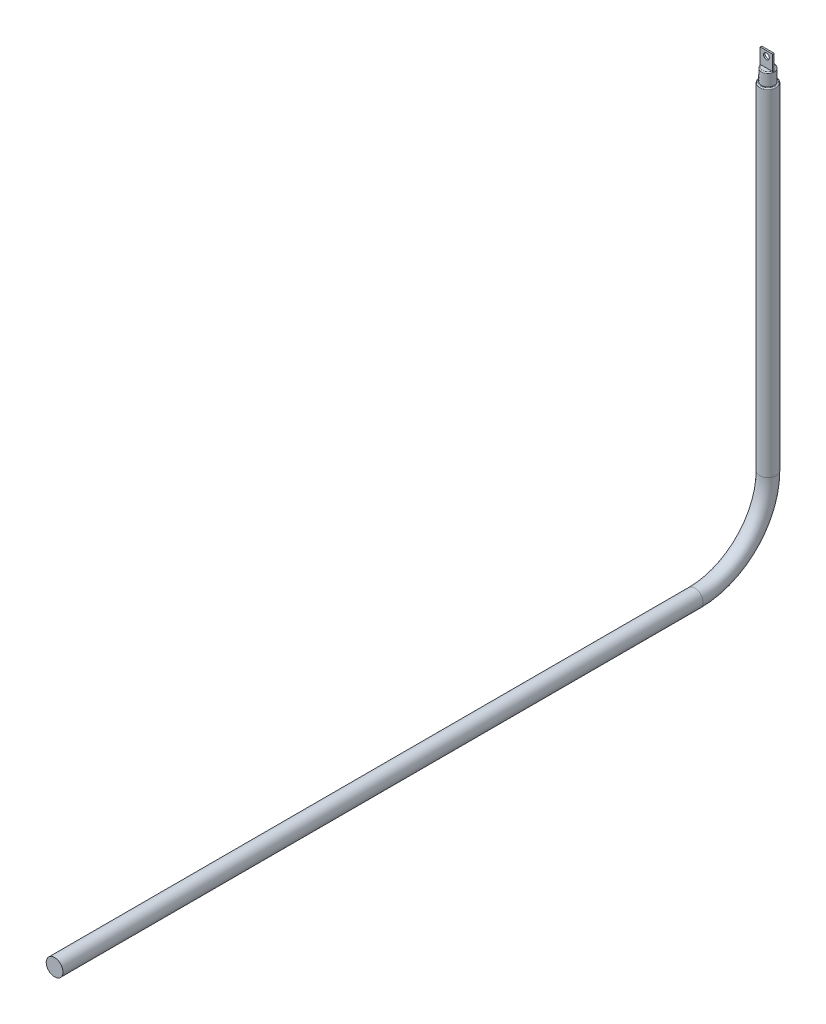
ISO-10303-21;
HEADER;
FILE_DESCRIPTION(('STEP AP214'),'2;1');
FILE_NAME('part.step','',(''),(''),'','','');
FILE_SCHEMA(('AUTOMOTIVE_DESIGN { 1 0 10303 214 1 1 1 1 }'));
ENDSEC;
DATA;
#1=APPLICATION_CONTEXT('core data for automotive mechanical design processes');
#2=APPLICATION_PROTOCOL_DEFINITION('international standard','automotive_design',2000,#1);
#3=PRODUCT_CONTEXT('',#1,'mechanical');
#4=PRODUCT('Part','Part','',(#3));
#5=PRODUCT_RELATED_PRODUCT_CATEGORY('part','',(#4));
#6=PRODUCT_DEFINITION_FORMATION('','',#4);
#7=PRODUCT_DEFINITION_CONTEXT('part definition',#1,'design');
#8=PRODUCT_DEFINITION('design','',#6,#7);
#9=PRODUCT_DEFINITION_SHAPE('','',#8);
#10=(LENGTH_UNIT() NAMED_UNIT(*) SI_UNIT(.MILLI.,.METRE.));
#11=(NAMED_UNIT(*) PLANE_ANGLE_UNIT() SI_UNIT($,.RADIAN.));
#12=(NAMED_UNIT(*) SI_UNIT($,.STERADIAN.) SOLID_ANGLE_UNIT());
#13=UNCERTAINTY_MEASURE_WITH_UNIT(LENGTH_MEASURE(1.E-05),#10,'distance_accuracy_value','');
#14=(GEOMETRIC_REPRESENTATION_CONTEXT(3) GLOBAL_UNCERTAINTY_ASSIGNED_CONTEXT((#13)) GLOBAL_UNIT_ASSIGNED_CONTEXT((#10,
#11,#12)) REPRESENTATION_CONTEXT('',''));
#15=CARTESIAN_POINT('',(0.,0.,0.));
#16=DIRECTION('',(0.,0.,1.));
#17=DIRECTION('',(1.,0.,0.));
#18=AXIS2_PLACEMENT_3D('',#15,#16,#17);
#19=CARTESIAN_POINT('',(1184.69403612085,-293.266225222462,2234.99322839701));
#20=DIRECTION('',(0.,1.,0.));
#21=DIRECTION('',(-1.,0.,0.));
#22=AXIS2_PLACEMENT_3D('',#19,#20,#21);
#23=PLANE('',#22);
#24=DIRECTION('',(1.,0.,0.));
#25=VECTOR('',#24,1.);
#26=CARTESIAN_POINT('',(1184.69403612085,-293.266225222462,2234.99322839701));
#27=LINE('',#26,#25);
#28=CARTESIAN_POINT('',(1174.23243644956,-293.266225222462,2234.99322839701));
#29=VERTEX_POINT('',#28);
#30=CARTESIAN_POINT('',(1195.15563579214,-293.266225222462,2234.99322839701));
#31=VERTEX_POINT('',#30);
#32=EDGE_CURVE('E136',#29,#31,#27,.T.);
#33=ORIENTED_EDGE('',*,*,#32,.T.);
#34=CARTESIAN_POINT('',(1184.69403612085,-293.266225222462,2234.99322839701));
#35=DIRECTION('',(0.,1.,0.));
#36=DIRECTION('',(-1.,0.,0.));
#37=AXIS2_PLACEMENT_3D('',#34,#35,#36);
#38=CIRCLE('',#37,10.4615996712898);
#39=EDGE_CURVE('E143',#31,#29,#38,.T.);
#40=ORIENTED_EDGE('',*,*,#39,.T.);
#41=EDGE_LOOP('',(#33,#40));
#42=FACE_BOUND('',#41,.T.);
#43=ADVANCED_FACE('F46',(#42),#23,.T.);
#44=DIRECTION('',(1.,0.,0.));
#45=VECTOR('',#44,1.);
#46=CARTESIAN_POINT('',(1184.69403612085,-293.266225222462,2237.99322839701));
#47=LINE('',#46,#45);
#48=CARTESIAN_POINT('',(1174.67180744244,-293.266225222462,2237.99322839701));
#49=VERTEX_POINT('',#48);
#50=CARTESIAN_POINT('',(1194.71626479926,-293.266225222462,2237.99322839701));
#51=VERTEX_POINT('',#50);
#52=EDGE_CURVE('E139',#49,#51,#47,.T.);
#53=ORIENTED_EDGE('',*,*,#52,.F.);
#54=CARTESIAN_POINT('',(1184.69403612085,-293.266225222462,2234.99322839701));
#55=DIRECTION('',(0.,1.,0.));
#56=DIRECTION('',(-1.,0.,0.));
#57=AXIS2_PLACEMENT_3D('',#54,#55,#56);
#58=CIRCLE('',#57,10.4615996712898);
#59=EDGE_CURVE('E141',#49,#51,#58,.T.);
#60=ORIENTED_EDGE('',*,*,#59,.T.);
#61=EDGE_LOOP('',(#53,#60));
#62=FACE_BOUND('',#61,.T.);
#63=ADVANCED_FACE('F203',(#62),#23,.T.);
#64=CARTESIAN_POINT('',(1184.69403612085,-317.266225222462,2234.99322839701));
#65=DIRECTION('',(0.,1.,0.));
#66=DIRECTION('',(-1.,0.,0.));
#67=AXIS2_PLACEMENT_3D('',#64,#65,#66);
#68=PLANE('',#67);
#69=CARTESIAN_POINT('',(1184.69403612085,-317.266225222462,2234.99322839701));
#70=DIRECTION('',(0.,1.,0.));
#71=DIRECTION('',(-1.,0.,0.));
#72=AXIS2_PLACEMENT_3D('',#69,#70,#71);
#73=CIRCLE('',#72,14.);
#74=CARTESIAN_POINT('',(1170.69403612085,-317.266225222462,2234.99322839701));
#75=VERTEX_POINT('',#74);
#76=EDGE_CURVE('E54',#75,#75,#73,.T.);
#77=ORIENTED_EDGE('',*,*,#76,.T.);
#78=EDGE_LOOP('',(#77));
#79=FACE_BOUND('',#78,.T.);
#80=CARTESIAN_POINT('',(1184.69403612085,-317.266225222462,2234.99322839701));
#81=DIRECTION('',(0.,1.,0.));
#82=DIRECTION('',(-1.,0.,0.));
#83=AXIS2_PLACEMENT_3D('',#80,#81,#82);
#84=CIRCLE('',#83,12.5);
#85=CARTESIAN_POINT('',(1172.19403612085,-317.266225222462,2234.99322839701));
#86=VERTEX_POINT('',#85);
#87=EDGE_CURVE('E121',#86,#86,#84,.T.);
#88=ORIENTED_EDGE('',*,*,#87,.F.);
#89=EDGE_LOOP('',(#88));
#90=FACE_BOUND('',#89,.T.);
#91=ADVANCED_FACE('F175',(#79,#90),#68,.T.);
#92=CARTESIAN_POINT('',(1184.69403612085,-1101.66757577343,3598.95299045824));
#93=DIRECTION('',(0.,0.,-1.));
#94=DIRECTION('',(-1.,0.,0.));
#95=AXIS2_PLACEMENT_3D('',#92,#93,#94);
#96=PLANE('',#95);
#97=CARTESIAN_POINT('',(1184.69403612085,-1101.66757577343,3598.95299045824));
#98=DIRECTION('',(0.,0.,-1.));
#99=DIRECTION('',(-1.,0.,0.));
#100=AXIS2_PLACEMENT_3D('',#97,#98,#99);
#101=CIRCLE('',#100,16.);
#102=CARTESIAN_POINT('',(1168.69403612085,-1101.66757577343,3598.95299045824));
#103=VERTEX_POINT('',#102);
#104=EDGE_CURVE('E134',#103,#103,#101,.T.);
#105=ORIENTED_EDGE('',*,*,#104,.F.);
#106=EDGE_LOOP('',(#105));
#107=FACE_BOUND('',#106,.T.);
#108=ADVANCED_FACE('F220',(#107),#96,.F.);
#109=CARTESIAN_POINT('',(1184.69403612085,-317.266225222462,2234.99322839701));
#110=DIRECTION('',(0.,-1.,0.));
#111=DIRECTION('',(0.,0.,-1.));
#112=AXIS2_PLACEMENT_3D('',#109,#110,#111);
#113=CYLINDRICAL_SURFACE('',#112,16.);
#114=CARTESIAN_POINT('',(1184.69403612085,-319.266225222462,2234.99322839701));
#115=DIRECTION('',(0.,1.,0.));
#116=DIRECTION('',(-1.,0.,0.));
#117=AXIS2_PLACEMENT_3D('',#114,#115,#116);
#118=CIRCLE('',#117,16.);
#119=CARTESIAN_POINT('',(1168.69403612085,-319.266225222462,2234.99322839701));
#120=VERTEX_POINT('',#119);
#121=EDGE_CURVE('E12',#120,#120,#118,.F.);
#122=ORIENTED_EDGE('',*,*,#121,.T.);
#123=EDGE_LOOP('',(#122));
#124=FACE_BOUND('',#123,.T.);
#125=CARTESIAN_POINT('',(1184.69403612085,-961.66757577343,2234.99322839701));
#126=DIRECTION('',(0.,1.,0.));
#127=DIRECTION('',(-1.,0.,0.));
#128=AXIS2_PLACEMENT_3D('',#125,#126,#127);
#129=CIRCLE('',#128,16.);
#130=CARTESIAN_POINT('',(1184.69403612085,-961.66757577343,2218.99322839701));
#131=VERTEX_POINT('',#130);
#132=EDGE_CURVE('E124',#131,#131,#129,.T.);
#133=ORIENTED_EDGE('',*,*,#132,.T.);
#134=EDGE_LOOP('',(#133));
#135=FACE_BOUND('',#134,.T.);
#136=ADVANCED_FACE('F216',(#124,#135),#113,.T.);
#137=CARTESIAN_POINT('',(1184.69403612085,-961.667575773431,2374.99322839701));
#138=DIRECTION('',(-1.,0.,0.));
#139=DIRECTION('',(0.,0.,1.));
#140=AXIS2_PLACEMENT_3D('',#137,#138,#139);
#141=TOROIDAL_SURFACE('',#140,140.,16.);
#142=CARTESIAN_POINT('',(1184.69403612083,-1101.66757577342,2374.99322839702));
#143=DIRECTION('',(0.,0.,-1.));
#144=DIRECTION('',(-1.,0.,0.));
#145=AXIS2_PLACEMENT_3D('',#142,#143,#144);
#146=CIRCLE('',#145,16.);
#147=CARTESIAN_POINT('',(1184.69403612083,-1117.66757577343,2374.99322839702));
#148=VERTEX_POINT('',#147);
#149=EDGE_CURVE('E131',#148,#148,#146,.T.);
#150=CARTESIAN_POINT('',(1184.69403612085,-961.667575773431,2374.99322839701));
#151=DIRECTION('',(-1.,0.,0.));
#152=DIRECTION('',(0.,0.,1.));
#153=AXIS2_PLACEMENT_3D('',#150,#151,#152);
#154=CIRCLE('',#153,156.);
#155=EDGE_CURVE('',#131,#148,#154,.T.);
#156=ORIENTED_EDGE('',*,*,#132,.F.);
#157=ORIENTED_EDGE('',*,*,#149,.T.);
#158=ORIENTED_EDGE('',*,*,#155,.T.);
#159=ORIENTED_EDGE('',*,*,#155,.F.);
#160=EDGE_LOOP('',(#156,#158,#157,#159));
#161=FACE_BOUND('',#160,.T.);
#162=ADVANCED_FACE('F219',(#161),#141,.T.);
#163=CARTESIAN_POINT('',(1184.69403612085,-1101.66757577343,2374.99322839701));
#164=DIRECTION('',(0.,0.,1.));
#165=DIRECTION('',(1.,0.,0.));
#166=AXIS2_PLACEMENT_3D('',#163,#164,#165);
#167=CYLINDRICAL_SURFACE('',#166,16.);
#168=ORIENTED_EDGE('',*,*,#104,.T.);
#169=EDGE_LOOP('',(#168));
#170=FACE_BOUND('',#169,.T.);
#171=ORIENTED_EDGE('',*,*,#149,.F.);
#172=EDGE_LOOP('',(#171));
#173=FACE_BOUND('',#172,.T.);
#174=ADVANCED_FACE('F210',(#170,#173),#167,.T.);
#175=CARTESIAN_POINT('',(1184.69403612085,-317.266225222462,2234.99322839701));
#176=DIRECTION('',(0.,-1.,0.));
#177=DIRECTION('',(-1.,0.,0.));
#178=AXIS2_PLACEMENT_3D('',#175,#176,#177);
#179=CONICAL_SURFACE('',#178,12.5,0.00174532925199433);
#180=CARTESIAN_POINT('',(1184.69403612085,-295.26273456573,2234.99322839701));
#181=DIRECTION('',(0.,-1.,0.));
#182=DIRECTION('',(1.,0.,0.));
#183=AXIS2_PLACEMENT_3D('',#180,#181,#182);
#184=CIRCLE('',#183,12.4615966251164);
#185=CARTESIAN_POINT('',(1197.15563274597,-295.26273456573,2234.99322839701));
#186=VERTEX_POINT('',#185);
#187=EDGE_CURVE('E146',#186,#186,#184,.T.);
#188=ORIENTED_EDGE('',*,*,#187,.T.);
#189=EDGE_LOOP('',(#188));
#190=FACE_BOUND('',#189,.T.);
#191=ORIENTED_EDGE('',*,*,#87,.T.);
#192=EDGE_LOOP('',(#191));
#193=FACE_BOUND('',#192,.T.);
#194=ADVANCED_FACE('F194',(#190,#193),#179,.T.);
#195=CARTESIAN_POINT('',(0.,0.,2237.99322839701));
#196=DIRECTION('',(0.,0.,1.));
#197=DIRECTION('',(1.,0.,0.));
#198=AXIS2_PLACEMENT_3D('',#195,#196,#197);
#199=PLANE('',#198);
#200=DIRECTION('',(0.,-1.,0.));
#201=VECTOR('',#200,1.);
#202=CARTESIAN_POINT('',(1172.69403612085,-264.321290843047,2237.99322839701));
#203=LINE('',#202,#201);
#204=CARTESIAN_POINT('',(1172.69403612085,-264.321290843047,2237.99322839701));
#205=VERTEX_POINT('',#204);
#206=CARTESIAN_POINT('',(1172.69403612085,-294.665712888201,2237.99322839701));
#207=VERTEX_POINT('',#206);
#208=EDGE_CURVE('E118',#205,#207,#203,.T.);
#209=ORIENTED_EDGE('',*,*,#208,.T.);
#210=CARTESIAN_POINT('',(1172.69403612085,-294.665712888201,2237.99322839701));
#211=CARTESIAN_POINT('',(1172.711319804,-294.612444029692,2237.99322839701));
#212=CARTESIAN_POINT('',(1172.73088562516,-294.559945802292,2237.99322839701));
#213=CARTESIAN_POINT('',(1172.7744223981,-294.456818988796,2237.99322839701));
#214=CARTESIAN_POINT('',(1172.79839260772,-294.406190089433,2237.99322839701));
#215=CARTESIAN_POINT('',(1172.87654721733,-294.257827349738,2237.99322839701));
#216=CARTESIAN_POINT('',(1172.93706590956,-294.163340975327,2237.99322839701));
#217=CARTESIAN_POINT('',(1173.07297818229,-293.985873265275,2237.99322839701));
#218=CARTESIAN_POINT('',(1173.14836958272,-293.902890246472,2237.99322839701));
#219=CARTESIAN_POINT('',(1173.31176613795,-293.750437743578,2237.99322839701));
#220=CARTESIAN_POINT('',(1173.3997720547,-293.68096907639,2237.99322839701));
#221=CARTESIAN_POINT('',(1173.58773693122,-293.555919650551,2237.99322839701));
#222=CARTESIAN_POINT('',(1173.68790288455,-293.500650667608,2237.99322839701));
#223=CARTESIAN_POINT('',(1173.89589841882,-293.407064239978,2237.99322839701));
#224=CARTESIAN_POINT('',(1174.00373023285,-293.368751758476,2237.99322839701));
#225=CARTESIAN_POINT('',(1174.20483382288,-293.314967399696,2237.99322839701));
#226=CARTESIAN_POINT('',(1174.29736607667,-293.296677799924,2237.99322839701));
#227=CARTESIAN_POINT('',(1174.48386591944,-293.272304417284,2237.99322839701));
#228=CARTESIAN_POINT('',(1174.57783079754,-293.266199913974,2237.99322839701));
#229=CARTESIAN_POINT('',(1174.67180744244,-293.266225222462,2237.99322839701));
#230=B_SPLINE_CURVE_WITH_KNOTS('',3,(#210,#211,#212,#213,#214,#215,#216,#217,#218,#219,#220,
#221,#222,#223,#224,#225,#226,#227,#228,#229),.UNSPECIFIED.,.F.,.F.,(4,2,2,2,2,2,2,2,2,4),(0.,
0.167900332778851,0.335772399582919,0.670655284674919,1.00548911811978,1.34034318499189,
1.68201930874052,2.02379537541848,2.30597979308581,2.58768395322937),.UNSPECIFIED.);
#231=EDGE_CURVE('E159',#207,#49,#230,.T.);
#232=ORIENTED_EDGE('',*,*,#231,.T.);
#233=ORIENTED_EDGE('',*,*,#52,.T.);
#234=CARTESIAN_POINT('',(1194.71626479926,-293.266225222462,2237.99322839701));
#235=CARTESIAN_POINT('',(1194.77634593861,-293.266226800071,2237.99322839701));
#236=CARTESIAN_POINT('',(1194.83640039592,-293.26871148189,2237.99322839701));
#237=CARTESIAN_POINT('',(1194.95610170596,-293.278653928856,2237.99322839701));
#238=CARTESIAN_POINT('',(1195.01574851776,-293.286112186139,2237.99322839701));
#239=CARTESIAN_POINT('',(1195.19351596622,-293.315954856103,2237.99322839701));
#240=CARTESIAN_POINT('',(1195.31047610129,-293.345807164603,2237.99322839701));
#241=CARTESIAN_POINT('',(1195.53773909537,-293.424915269343,2237.99322839701));
#242=CARTESIAN_POINT('',(1195.64803449296,-293.474192364593,2237.99322839701));
#243=CARTESIAN_POINT('',(1195.85844568553,-293.591024835356,2237.99322839701));
#244=CARTESIAN_POINT('',(1195.95856744825,-293.65856940921,2237.99322839701));
#245=CARTESIAN_POINT('',(1196.14304842176,-293.808284644468,2237.99322839701));
#246=CARTESIAN_POINT('',(1196.22773977802,-293.890046336504,2237.99322839701));
#247=CARTESIAN_POINT('',(1196.38157047811,-294.067076722477,2237.99322839701));
#248=CARTESIAN_POINT('',(1196.45072006871,-294.162336449132,2237.99322839701));
#249=CARTESIAN_POINT('',(1196.54886878728,-294.326356806633,2237.99322839701));
#250=CARTESIAN_POINT('',(1196.5832726837,-294.391943998781,2237.99322839701));
#251=CARTESIAN_POINT('',(1196.64445416419,-294.526480852642,2237.99322839701));
#252=CARTESIAN_POINT('',(1196.67124147258,-294.595426094032,2237.99322839701));
#253=CARTESIAN_POINT('',(1196.69403612085,-294.665712888201,2237.99322839701));
#254=B_SPLINE_CURVE_WITH_KNOTS('',3,(#234,#235,#236,#237,#238,#239,#240,#241,#242,#243,#244,
#245,#246,#247,#248,#249,#250,#251,#252,#253),.UNSPECIFIED.,.F.,.F.,(4,2,2,2,2,2,2,2,2,4),(0.,
0.180137711647317,0.360293250634487,0.720567338043534,1.08123756477001,1.44169498974533,
1.79311892381039,2.14431047807276,2.36606526568343,2.58753564799402),.UNSPECIFIED.);
#255=CARTESIAN_POINT('',(1196.69403612085,-294.665712888201,2237.99322839701));
#256=VERTEX_POINT('',#255);
#257=EDGE_CURVE('E107',#51,#256,#254,.T.);
#258=ORIENTED_EDGE('',*,*,#257,.T.);
#259=DIRECTION('',(0.,1.,0.));
#260=VECTOR('',#259,1.);
#261=CARTESIAN_POINT('',(1196.69403612085,-264.321290843047,2237.99322839701));
#262=LINE('',#261,#260);
#263=CARTESIAN_POINT('',(1196.69403612085,-264.321290843047,2237.99322839701));
#264=VERTEX_POINT('',#263);
#265=EDGE_CURVE('E68',#256,#264,#262,.T.);
#266=ORIENTED_EDGE('',*,*,#265,.T.);
#267=DIRECTION('',(-1.,0.,0.));
#268=VECTOR('',#267,1.);
#269=CARTESIAN_POINT('',(1172.69403612085,-264.321290843047,2237.99322839701));
#270=LINE('',#269,#268);
#271=EDGE_CURVE('E103',#264,#205,#270,.T.);
#272=ORIENTED_EDGE('',*,*,#271,.T.);
#273=EDGE_LOOP('',(#209,#232,#233,#258,#266,#272));
#274=FACE_BOUND('',#273,.T.);
#275=CARTESIAN_POINT('',(1184.69403612085,-273.81048748466,2237.99322839701));
#276=DIRECTION('',(0.,0.,1.));
#277=DIRECTION('',(1.,0.,0.));
#278=AXIS2_PLACEMENT_3D('',#275,#276,#277);
#279=CIRCLE('',#278,5.50000000000007);
#280=CARTESIAN_POINT('',(1190.19403612085,-273.81048748466,2237.99322839701));
#281=VERTEX_POINT('',#280);
#282=EDGE_CURVE('E261',#281,#281,#279,.T.);
#283=ORIENTED_EDGE('',*,*,#282,.F.);
#284=EDGE_LOOP('',(#283));
#285=FACE_BOUND('',#284,.T.);
#286=ADVANCED_FACE('F101',(#274,#285),#199,.T.);
#287=CARTESIAN_POINT('',(0.,0.,2234.99322839701));
#288=DIRECTION('',(0.,0.,1.));
#289=DIRECTION('',(1.,0.,0.));
#290=AXIS2_PLACEMENT_3D('',#287,#288,#289);
#291=PLANE('',#290);
#292=ORIENTED_EDGE('',*,*,#32,.F.);
#293=CARTESIAN_POINT('',(1174.23243644956,-295.266225222462,2234.99322839701));
#294=DIRECTION('',(0.,0.,1.));
#295=DIRECTION('',(1.,0.,0.));
#296=AXIS2_PLACEMENT_3D('',#293,#294,#295);
#297=CIRCLE('',#296,2.);
#298=CARTESIAN_POINT('',(1172.69403612085,-293.988209405414,2234.99322839701));
#299=VERTEX_POINT('',#298);
#300=EDGE_CURVE('E149',#29,#299,#297,.T.);
#301=ORIENTED_EDGE('',*,*,#300,.T.);
#302=DIRECTION('',(0.,-1.,0.));
#303=VECTOR('',#302,1.);
#304=CARTESIAN_POINT('',(1172.69403612085,-264.321290843047,2234.99322839701));
#305=LINE('',#304,#303);
#306=CARTESIAN_POINT('',(1172.69403612085,-264.321290843047,2234.99322839701));
#307=VERTEX_POINT('',#306);
#308=EDGE_CURVE('E109',#307,#299,#305,.T.);
#309=ORIENTED_EDGE('',*,*,#308,.F.);
#310=DIRECTION('',(-1.,0.,0.));
#311=VECTOR('',#310,1.);
#312=CARTESIAN_POINT('',(1172.69403612085,-264.321290843047,2234.99322839701));
#313=LINE('',#312,#311);
#314=CARTESIAN_POINT('',(1196.69403612085,-264.321290843047,2234.99322839701));
#315=VERTEX_POINT('',#314);
#316=EDGE_CURVE('E257',#315,#307,#313,.T.);
#317=ORIENTED_EDGE('',*,*,#316,.F.);
#318=DIRECTION('',(0.,1.,0.));
#319=VECTOR('',#318,1.);
#320=CARTESIAN_POINT('',(1196.69403612085,-264.321290843047,2234.99322839701));
#321=LINE('',#320,#319);
#322=CARTESIAN_POINT('',(1196.69403612085,-293.988209405414,2234.99322839701));
#323=VERTEX_POINT('',#322);
#324=EDGE_CURVE('E61',#323,#315,#321,.T.);
#325=ORIENTED_EDGE('',*,*,#324,.F.);
#326=CARTESIAN_POINT('',(1195.15563579214,-295.266225222462,2234.99322839701));
#327=DIRECTION('',(0.,0.,1.));
#328=DIRECTION('',(1.,0.,0.));
#329=AXIS2_PLACEMENT_3D('',#326,#327,#328);
#330=CIRCLE('',#329,2.);
#331=EDGE_CURVE('E248',#323,#31,#330,.T.);
#332=ORIENTED_EDGE('',*,*,#331,.T.);
#333=EDGE_LOOP('',(#292,#301,#309,#317,#325,#332));
#334=FACE_BOUND('',#333,.T.);
#335=CARTESIAN_POINT('',(1184.69403612085,-273.81048748466,2234.99322839701));
#336=DIRECTION('',(0.,0.,1.));
#337=DIRECTION('',(1.,0.,0.));
#338=AXIS2_PLACEMENT_3D('',#335,#336,#337);
#339=CIRCLE('',#338,5.50000000000007);
#340=CARTESIAN_POINT('',(1190.19403612085,-273.81048748466,2234.99322839701));
#341=VERTEX_POINT('',#340);
#342=EDGE_CURVE('E263',#341,#341,#339,.T.);
#343=ORIENTED_EDGE('',*,*,#342,.T.);
#344=EDGE_LOOP('',(#343));
#345=FACE_BOUND('',#344,.T.);
#346=ADVANCED_FACE('F193',(#334,#345),#291,.F.);
#347=CARTESIAN_POINT('',(1196.69403612085,-264.321290843047,2237.99322839701));
#348=DIRECTION('',(-1.,0.,0.));
#349=DIRECTION('',(0.,0.,1.));
#350=AXIS2_PLACEMENT_3D('',#347,#348,#349);
#351=PLANE('',#350);
#352=ORIENTED_EDGE('',*,*,#265,.F.);
#353=CARTESIAN_POINT('',(1196.69403612085,-294.665712888201,2237.99322839701));
#354=CARTESIAN_POINT('',(1196.69403612085,-294.639136769407,2237.9586890655));
#355=CARTESIAN_POINT('',(1196.69403612085,-294.614031069471,2237.92307380454));
#356=CARTESIAN_POINT('',(1196.69403612085,-294.566449892467,2237.8501963603));
#357=CARTESIAN_POINT('',(1196.69403612085,-294.543970531421,2237.81293672419));
#358=CARTESIAN_POINT('',(1196.69403612085,-294.501367270437,2237.73737042346));
#359=CARTESIAN_POINT('',(1196.69403612085,-294.481231497934,2237.69907036839));
#360=CARTESIAN_POINT('',(1196.69403612085,-294.442904711366,2237.62149483118));
#361=CARTESIAN_POINT('',(1196.69403612085,-294.424714534033,2237.58221893824));
#362=CARTESIAN_POINT('',(1196.69403612085,-294.373284973604,2237.46455356644));
#363=CARTESIAN_POINT('',(1196.69403612085,-294.342511275193,2237.3850838721));
#364=CARTESIAN_POINT('',(1196.69403612085,-294.286273986709,2237.22418410512));
#365=CARTESIAN_POINT('',(1196.69403612085,-294.260819424776,2237.14275095698));
#366=CARTESIAN_POINT('',(1196.69403612085,-294.214269333454,2236.97832726019));
#367=CARTESIAN_POINT('',(1196.69403612085,-294.193190581507,2236.89533200123));
#368=CARTESIAN_POINT('',(1196.69403612085,-294.154837993518,2236.72846376911));
#369=CARTESIAN_POINT('',(1196.69403612085,-294.137564957669,2236.64459061524));
#370=CARTESIAN_POINT('',(1196.69403612085,-294.090655714499,2236.39197701041));
#371=CARTESIAN_POINT('',(1196.69403612085,-294.065947072347,2236.22230856168));
#372=CARTESIAN_POINT('',(1196.69403612085,-294.036470756036,2235.96410483741));
#373=CARTESIAN_POINT('',(1196.69403612085,-294.027835960517,2235.87596637684));
#374=CARTESIAN_POINT('',(1196.69403612085,-294.013187628897,2235.69946134611));
#375=CARTESIAN_POINT('',(1196.69403612085,-294.007174221767,2235.61109476494));
#376=CARTESIAN_POINT('',(1196.69403612085,-293.997627142175,2235.43450290829));
#377=CARTESIAN_POINT('',(1196.69403612085,-293.994085920488,2235.34627803071));
#378=CARTESIAN_POINT('',(1196.69403612085,-293.989382172082,2235.16977794463));
#379=CARTESIAN_POINT('',(1196.69403612085,-293.988219284804,2235.08150274579));
#380=CARTESIAN_POINT('',(1196.69403612085,-293.988209405414,2234.99322839701));
#381=B_SPLINE_CURVE_WITH_KNOTS('',3,(#353,#354,#355,#356,#357,#358,#359,#360,#361,#362,#363,
#364,#365,#366,#367,#368,#369,#370,#371,#372,#373,#374,#375,#376,#377,#378,#379,#380),
.UNSPECIFIED.,.F.,.F.,(4,2,2,2,2,2,2,2,2,2,2,2,2,4),(0.,0.130639714764851,0.261083718909331,
0.390835133341014,0.520642126888458,0.776029411071084,1.03184670365338,1.28862742158197,
1.54546207897062,2.05933620717297,2.32499451154467,2.5906658845306,2.85552239511761,
3.12033875007263),.UNSPECIFIED.);
#382=EDGE_CURVE('E184',#256,#323,#381,.T.);
#383=ORIENTED_EDGE('',*,*,#382,.T.);
#384=ORIENTED_EDGE('',*,*,#324,.T.);
#385=DIRECTION('',(0.,0.,-1.));
#386=VECTOR('',#385,1.);
#387=CARTESIAN_POINT('',(1196.69403612085,-264.321290843047,2237.99322839701));
#388=LINE('',#387,#386);
#389=EDGE_CURVE('E114',#264,#315,#388,.T.);
#390=ORIENTED_EDGE('',*,*,#389,.F.);
#391=EDGE_LOOP('',(#352,#383,#384,#390));
#392=FACE_BOUND('',#391,.T.);
#393=ADVANCED_FACE('F120',(#392),#351,.F.);
#394=CARTESIAN_POINT('',(1172.69403612085,-264.321290843047,2237.99322839701));
#395=DIRECTION('',(0.,-1.,0.));
#396=DIRECTION('',(0.,0.,-1.));
#397=AXIS2_PLACEMENT_3D('',#394,#395,#396);
#398=PLANE('',#397);
#399=ORIENTED_EDGE('',*,*,#316,.T.);
#400=DIRECTION('',(0.,0.,-1.));
#401=VECTOR('',#400,1.);
#402=CARTESIAN_POINT('',(1172.69403612085,-264.321290843047,2237.99322839701));
#403=LINE('',#402,#401);
#404=EDGE_CURVE('E116',#205,#307,#403,.T.);
#405=ORIENTED_EDGE('',*,*,#404,.F.);
#406=ORIENTED_EDGE('',*,*,#271,.F.);
#407=ORIENTED_EDGE('',*,*,#389,.T.);
#408=EDGE_LOOP('',(#399,#405,#406,#407));
#409=FACE_BOUND('',#408,.T.);
#410=ADVANCED_FACE('F113',(#409),#398,.F.);
#411=CARTESIAN_POINT('',(1172.69403612085,-264.321290843047,2237.99322839701));
#412=DIRECTION('',(1.,0.,0.));
#413=DIRECTION('',(0.,0.,-1.));
#414=AXIS2_PLACEMENT_3D('',#411,#412,#413);
#415=PLANE('',#414);
#416=ORIENTED_EDGE('',*,*,#308,.T.);
#417=CARTESIAN_POINT('',(1172.69403612085,-293.988209405414,2234.99322839701));
#418=CARTESIAN_POINT('',(1172.69403612085,-293.988219858967,2235.08275113753));
#419=CARTESIAN_POINT('',(1172.69403612085,-293.989415586647,2235.17227479567));
#420=CARTESIAN_POINT('',(1172.69403612085,-293.994253741669,2235.35127019597));
#421=CARTESIAN_POINT('',(1172.69403612085,-293.997896567031,2235.4407419273));
#422=CARTESIAN_POINT('',(1172.69403612085,-294.007722093834,2235.61986007514));
#423=CARTESIAN_POINT('',(1172.69403612085,-294.013913544893,2235.709506024));
#424=CARTESIAN_POINT('',(1172.69403612085,-294.029002875917,2235.88855841496));
#425=CARTESIAN_POINT('',(1172.69403612085,-294.037900610441,2235.97796486966));
#426=CARTESIAN_POINT('',(1172.69403612085,-294.0682708336,2236.23969410297));
#427=CARTESIAN_POINT('',(1172.69403612085,-294.093732635922,2236.41160150904));
#428=CARTESIAN_POINT('',(1172.69403612085,-294.142149472986,2236.66745300156));
#429=CARTESIAN_POINT('',(1172.69403612085,-294.159986037126,2236.75237847212));
#430=CARTESIAN_POINT('',(1172.69403612085,-294.1996272779,2236.92129242864));
#431=CARTESIAN_POINT('',(1172.69403612085,-294.221431015342,2237.00528113139));
#432=CARTESIAN_POINT('',(1172.69403612085,-294.268661487527,2237.16821809768));
#433=CARTESIAN_POINT('',(1172.69403612085,-294.293884544473,2237.24722465701));
#434=CARTESIAN_POINT('',(1172.69403612085,-294.349452270406,2237.4032924128));
#435=CARTESIAN_POINT('',(1172.69403612085,-294.379788618698,2237.4803565396));
#436=CARTESIAN_POINT('',(1172.69403612085,-294.447372422501,2237.63293850926));
#437=CARTESIAN_POINT('',(1172.69403612085,-294.48472125741,2237.7084128449));
#438=CARTESIAN_POINT('',(1172.69403612085,-294.54714856244,2237.81824887067));
#439=CARTESIAN_POINT('',(1172.69403612085,-294.569090428833,2237.85438777287));
#440=CARTESIAN_POINT('',(1172.69403612085,-294.615458377068,2237.92510106493));
#441=CARTESIAN_POINT('',(1172.69403612085,-294.639887926243,2237.95967317134));
#442=CARTESIAN_POINT('',(1172.69403612085,-294.665712888202,2237.99322839701));
#443=B_SPLINE_CURVE_WITH_KNOTS('',3,(#417,#418,#419,#420,#421,#422,#423,#424,#425,#426,#427,
#428,#429,#430,#431,#432,#433,#434,#435,#436,#437,#438,#439,#440,#441,#442),.UNSPECIFIED.,.F.,
.F.,(4,2,2,2,2,2,2,2,2,2,2,2,4),(0.,0.268561286006677,0.53716626429981,0.806701177410388,
1.07622160769786,1.59704058740562,1.85730482827888,2.11750753392101,2.36616502415711,
2.6144217209155,2.86659074379078,2.99333566839549,3.12025973307103),.UNSPECIFIED.);
#444=EDGE_CURVE('E152',#299,#207,#443,.T.);
#445=ORIENTED_EDGE('',*,*,#444,.T.);
#446=ORIENTED_EDGE('',*,*,#208,.F.);
#447=ORIENTED_EDGE('',*,*,#404,.T.);
#448=EDGE_LOOP('',(#416,#445,#446,#447));
#449=FACE_BOUND('',#448,.T.);
#450=ADVANCED_FACE('F165',(#449),#415,.F.);
#451=CARTESIAN_POINT('',(1184.69403612085,-273.81048748466,2237.99322839701));
#452=DIRECTION('',(0.,0.,-1.));
#453=DIRECTION('',(-1.,0.,0.));
#454=AXIS2_PLACEMENT_3D('',#451,#452,#453);
#455=CYLINDRICAL_SURFACE('',#454,5.50000000000007);
#456=ORIENTED_EDGE('',*,*,#282,.T.);
#457=EDGE_LOOP('',(#456));
#458=FACE_BOUND('',#457,.T.);
#459=ORIENTED_EDGE('',*,*,#342,.F.);
#460=EDGE_LOOP('',(#459));
#461=FACE_BOUND('',#460,.T.);
#462=ADVANCED_FACE('F173',(#458,#461),#455,.F.);
#463=CARTESIAN_POINT('',(1184.69403612085,-295.266225222462,2234.99322839701));
#464=DIRECTION('',(0.,1.,0.));
#465=DIRECTION('',(-1.,0.,0.));
#466=AXIS2_PLACEMENT_3D('',#463,#464,#465);
#467=TOROIDAL_SURFACE('',#466,10.4615996712898,2.);
#468=ORIENTED_EDGE('',*,*,#187,.F.);
#469=EDGE_LOOP('',(#468));
#470=FACE_BOUND('',#469,.T.);
#471=ORIENTED_EDGE('',*,*,#300,.F.);
#472=ORIENTED_EDGE('',*,*,#39,.F.);
#473=ORIENTED_EDGE('',*,*,#331,.F.);
#474=ORIENTED_EDGE('',*,*,#382,.F.);
#475=ORIENTED_EDGE('',*,*,#257,.F.);
#476=ORIENTED_EDGE('',*,*,#59,.F.);
#477=ORIENTED_EDGE('',*,*,#231,.F.);
#478=ORIENTED_EDGE('',*,*,#444,.F.);
#479=EDGE_LOOP('',(#471,#472,#473,#474,#475,#476,#477,#478));
#480=FACE_BOUND('',#479,.T.);
#481=ADVANCED_FACE('F169',(#470,#480),#467,.T.);
#482=CARTESIAN_POINT('',(1184.69403612085,-319.266225222462,2234.99322839701));
#483=DIRECTION('',(0.,1.,0.));
#484=DIRECTION('',(-1.,0.,0.));
#485=AXIS2_PLACEMENT_3D('',#482,#483,#484);
#486=TOROIDAL_SURFACE('',#485,14.,2.);
#487=ORIENTED_EDGE('',*,*,#121,.F.);
#488=EDGE_LOOP('',(#487));
#489=FACE_BOUND('',#488,.T.);
#490=ORIENTED_EDGE('',*,*,#76,.F.);
#491=EDGE_LOOP('',(#490));
#492=FACE_BOUND('',#491,.T.);
#493=ADVANCED_FACE('F48',(#489,#492),#486,.T.);
#494=CLOSED_SHELL('',(#43,#63,#91,#108,#136,#162,#174,#194,#286,#346,#393,#410,#450,#462,#481,#493));
#495=MANIFOLD_SOLID_BREP('B2',#494);
#496=ADVANCED_BREP_SHAPE_REPRESENTATION('',(#18,#495),#14);
#497=SHAPE_DEFINITION_REPRESENTATION(#9,#496);
ENDSEC;
END-ISO-10303-21;
